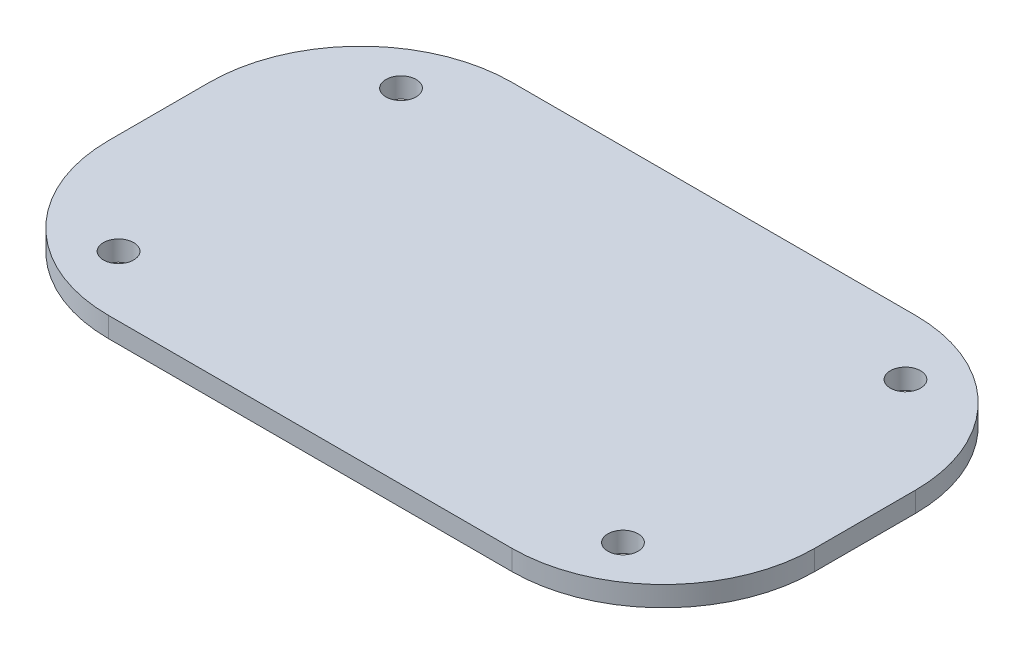
ISO-10303-21;
HEADER;
FILE_DESCRIPTION(('STEP AP214'),'2;1');
FILE_NAME('part.step','',(''),(''),'','','');
FILE_SCHEMA(('AUTOMOTIVE_DESIGN { 1 0 10303 214 1 1 1 1 }'));
ENDSEC;
DATA;
#1=APPLICATION_CONTEXT('core data for automotive mechanical design processes');
#2=APPLICATION_PROTOCOL_DEFINITION('international standard','automotive_design',2000,#1);
#3=PRODUCT_CONTEXT('',#1,'mechanical');
#4=PRODUCT('Part','Part','',(#3));
#5=PRODUCT_RELATED_PRODUCT_CATEGORY('part','',(#4));
#6=PRODUCT_DEFINITION_FORMATION('','',#4);
#7=PRODUCT_DEFINITION_CONTEXT('part definition',#1,'design');
#8=PRODUCT_DEFINITION('design','',#6,#7);
#9=PRODUCT_DEFINITION_SHAPE('','',#8);
#10=(LENGTH_UNIT() NAMED_UNIT(*) SI_UNIT(.MILLI.,.METRE.));
#11=(NAMED_UNIT(*) PLANE_ANGLE_UNIT() SI_UNIT($,.RADIAN.));
#12=(NAMED_UNIT(*) SI_UNIT($,.STERADIAN.) SOLID_ANGLE_UNIT());
#13=UNCERTAINTY_MEASURE_WITH_UNIT(LENGTH_MEASURE(1.E-05),#10,'distance_accuracy_value','');
#14=(GEOMETRIC_REPRESENTATION_CONTEXT(3) GLOBAL_UNCERTAINTY_ASSIGNED_CONTEXT((#13)) GLOBAL_UNIT_ASSIGNED_CONTEXT((#10,
#11,#12)) REPRESENTATION_CONTEXT('',''));
#15=CARTESIAN_POINT('',(0.,0.,0.));
#16=DIRECTION('',(0.,0.,1.));
#17=DIRECTION('',(1.,0.,0.));
#18=AXIS2_PLACEMENT_3D('',#15,#16,#17);
#19=CARTESIAN_POINT('',(35.,2.,20.));
#20=DIRECTION('',(-1.,0.,0.));
#21=DIRECTION('',(0.,0.,1.));
#22=AXIS2_PLACEMENT_3D('',#19,#20,#21);
#23=PLANE('',#22);
#24=DIRECTION('',(0.,0.,-1.));
#25=VECTOR('',#24,1.);
#26=CARTESIAN_POINT('',(35.,2.,20.));
#27=LINE('',#26,#25);
#28=CARTESIAN_POINT('',(35.,2.,5.));
#29=VERTEX_POINT('',#28);
#30=CARTESIAN_POINT('',(35.,2.,-5.));
#31=VERTEX_POINT('',#30);
#32=EDGE_CURVE('E126',#29,#31,#27,.T.);
#33=ORIENTED_EDGE('',*,*,#32,.F.);
#34=DIRECTION('',(0.,-1.,0.));
#35=VECTOR('',#34,1.);
#36=CARTESIAN_POINT('',(35.,2.,5.));
#37=LINE('',#36,#35);
#38=CARTESIAN_POINT('',(35.,0.,5.));
#39=VERTEX_POINT('',#38);
#40=EDGE_CURVE('E152',#29,#39,#37,.T.);
#41=ORIENTED_EDGE('',*,*,#40,.T.);
#42=DIRECTION('',(0.,0.,-1.));
#43=VECTOR('',#42,1.);
#44=CARTESIAN_POINT('',(35.,0.,20.));
#45=LINE('',#44,#43);
#46=CARTESIAN_POINT('',(35.,0.,-5.));
#47=VERTEX_POINT('',#46);
#48=EDGE_CURVE('E158',#39,#47,#45,.T.);
#49=ORIENTED_EDGE('',*,*,#48,.T.);
#50=DIRECTION('',(0.,-1.,0.));
#51=VECTOR('',#50,1.);
#52=CARTESIAN_POINT('',(35.,2.,-5.));
#53=LINE('',#52,#51);
#54=EDGE_CURVE('E150',#47,#31,#53,.F.);
#55=ORIENTED_EDGE('',*,*,#54,.T.);
#56=EDGE_LOOP('',(#33,#41,#49,#55));
#57=FACE_BOUND('',#56,.T.);
#58=ADVANCED_FACE('F34',(#57),#23,.F.);
#59=CARTESIAN_POINT('',(-35.,2.,-20.));
#60=DIRECTION('',(0.,0.,1.));
#61=DIRECTION('',(1.,0.,0.));
#62=AXIS2_PLACEMENT_3D('',#59,#60,#61);
#63=PLANE('',#62);
#64=DIRECTION('',(-1.,0.,0.));
#65=VECTOR('',#64,1.);
#66=CARTESIAN_POINT('',(-35.,2.,-20.));
#67=LINE('',#66,#65);
#68=CARTESIAN_POINT('',(20.,2.,-20.));
#69=VERTEX_POINT('',#68);
#70=CARTESIAN_POINT('',(-20.,2.,-20.));
#71=VERTEX_POINT('',#70);
#72=EDGE_CURVE('E129',#69,#71,#67,.T.);
#73=ORIENTED_EDGE('',*,*,#72,.F.);
#74=DIRECTION('',(0.,-1.,0.));
#75=VECTOR('',#74,1.);
#76=CARTESIAN_POINT('',(20.,2.,-20.));
#77=LINE('',#76,#75);
#78=CARTESIAN_POINT('',(20.,0.,-20.));
#79=VERTEX_POINT('',#78);
#80=EDGE_CURVE('E11',#69,#79,#77,.T.);
#81=ORIENTED_EDGE('',*,*,#80,.T.);
#82=DIRECTION('',(-1.,0.,0.));
#83=VECTOR('',#82,1.);
#84=CARTESIAN_POINT('',(-35.,0.,-20.));
#85=LINE('',#84,#83);
#86=CARTESIAN_POINT('',(-20.,0.,-20.));
#87=VERTEX_POINT('',#86);
#88=EDGE_CURVE('E131',#79,#87,#85,.T.);
#89=ORIENTED_EDGE('',*,*,#88,.T.);
#90=DIRECTION('',(0.,-1.,0.));
#91=VECTOR('',#90,1.);
#92=CARTESIAN_POINT('',(-20.,2.,-20.));
#93=LINE('',#92,#91);
#94=EDGE_CURVE('E42',#87,#71,#93,.F.);
#95=ORIENTED_EDGE('',*,*,#94,.T.);
#96=EDGE_LOOP('',(#73,#81,#89,#95));
#97=FACE_BOUND('',#96,.T.);
#98=ADVANCED_FACE('F219',(#97),#63,.F.);
#99=CARTESIAN_POINT('',(-35.,2.,20.));
#100=DIRECTION('',(1.,0.,0.));
#101=DIRECTION('',(0.,0.,-1.));
#102=AXIS2_PLACEMENT_3D('',#99,#100,#101);
#103=PLANE('',#102);
#104=DIRECTION('',(0.,0.,1.));
#105=VECTOR('',#104,1.);
#106=CARTESIAN_POINT('',(-35.,0.,20.));
#107=LINE('',#106,#105);
#108=CARTESIAN_POINT('',(-35.,0.,-5.));
#109=VERTEX_POINT('',#108);
#110=CARTESIAN_POINT('',(-35.,0.,5.));
#111=VERTEX_POINT('',#110);
#112=EDGE_CURVE('E127',#109,#111,#107,.T.);
#113=ORIENTED_EDGE('',*,*,#112,.T.);
#114=DIRECTION('',(0.,-1.,0.));
#115=VECTOR('',#114,1.);
#116=CARTESIAN_POINT('',(-35.,2.,5.));
#117=LINE('',#116,#115);
#118=CARTESIAN_POINT('',(-35.,2.,5.));
#119=VERTEX_POINT('',#118);
#120=EDGE_CURVE('E105',#111,#119,#117,.F.);
#121=ORIENTED_EDGE('',*,*,#120,.T.);
#122=DIRECTION('',(0.,0.,1.));
#123=VECTOR('',#122,1.);
#124=CARTESIAN_POINT('',(-35.,2.,20.));
#125=LINE('',#124,#123);
#126=CARTESIAN_POINT('',(-35.,2.,-5.));
#127=VERTEX_POINT('',#126);
#128=EDGE_CURVE('E170',#127,#119,#125,.T.);
#129=ORIENTED_EDGE('',*,*,#128,.F.);
#130=DIRECTION('',(0.,-1.,0.));
#131=VECTOR('',#130,1.);
#132=CARTESIAN_POINT('',(-35.,2.,-5.));
#133=LINE('',#132,#131);
#134=EDGE_CURVE('E110',#127,#109,#133,.T.);
#135=ORIENTED_EDGE('',*,*,#134,.T.);
#136=EDGE_LOOP('',(#113,#121,#129,#135));
#137=FACE_BOUND('',#136,.T.);
#138=ADVANCED_FACE('F217',(#137),#103,.F.);
#139=CARTESIAN_POINT('',(-35.,2.,20.));
#140=DIRECTION('',(0.,0.,-1.));
#141=DIRECTION('',(-1.,0.,0.));
#142=AXIS2_PLACEMENT_3D('',#139,#140,#141);
#143=PLANE('',#142);
#144=DIRECTION('',(1.,0.,0.));
#145=VECTOR('',#144,1.);
#146=CARTESIAN_POINT('',(-35.,2.,20.));
#147=LINE('',#146,#145);
#148=CARTESIAN_POINT('',(-20.,2.,20.));
#149=VERTEX_POINT('',#148);
#150=CARTESIAN_POINT('',(20.,2.,20.));
#151=VERTEX_POINT('',#150);
#152=EDGE_CURVE('E120',#149,#151,#147,.T.);
#153=ORIENTED_EDGE('',*,*,#152,.F.);
#154=DIRECTION('',(0.,-1.,0.));
#155=VECTOR('',#154,1.);
#156=CARTESIAN_POINT('',(-20.,2.,20.));
#157=LINE('',#156,#155);
#158=CARTESIAN_POINT('',(-20.,0.,20.));
#159=VERTEX_POINT('',#158);
#160=EDGE_CURVE('E104',#149,#159,#157,.T.);
#161=ORIENTED_EDGE('',*,*,#160,.T.);
#162=DIRECTION('',(1.,0.,0.));
#163=VECTOR('',#162,1.);
#164=CARTESIAN_POINT('',(-35.,0.,20.));
#165=LINE('',#164,#163);
#166=CARTESIAN_POINT('',(20.,0.,20.));
#167=VERTEX_POINT('',#166);
#168=EDGE_CURVE('E117',#159,#167,#165,.T.);
#169=ORIENTED_EDGE('',*,*,#168,.T.);
#170=DIRECTION('',(0.,-1.,0.));
#171=VECTOR('',#170,1.);
#172=CARTESIAN_POINT('',(20.,2.,20.));
#173=LINE('',#172,#171);
#174=EDGE_CURVE('E122',#167,#151,#173,.F.);
#175=ORIENTED_EDGE('',*,*,#174,.T.);
#176=EDGE_LOOP('',(#153,#161,#169,#175));
#177=FACE_BOUND('',#176,.T.);
#178=ADVANCED_FACE('F116',(#177),#143,.F.);
#179=CARTESIAN_POINT('',(0.,2.,0.));
#180=DIRECTION('',(0.,-1.,0.));
#181=DIRECTION('',(0.,0.,-1.));
#182=AXIS2_PLACEMENT_3D('',#179,#180,#181);
#183=PLANE('',#182);
#184=CARTESIAN_POINT('',(25.,2.,-14.));
#185=DIRECTION('',(0.,1.,0.));
#186=DIRECTION('',(0.,0.,1.));
#187=AXIS2_PLACEMENT_3D('',#184,#185,#186);
#188=CIRCLE('',#187,1.5);
#189=CARTESIAN_POINT('',(25.,2.,-12.5));
#190=VERTEX_POINT('',#189);
#191=EDGE_CURVE('E189',#190,#190,#188,.T.);
#192=ORIENTED_EDGE('',*,*,#191,.F.);
#193=EDGE_LOOP('',(#192));
#194=FACE_BOUND('',#193,.T.);
#195=CARTESIAN_POINT('',(25.,2.,14.));
#196=DIRECTION('',(0.,1.,0.));
#197=DIRECTION('',(0.,0.,1.));
#198=AXIS2_PLACEMENT_3D('',#195,#196,#197);
#199=CIRCLE('',#198,1.5);
#200=CARTESIAN_POINT('',(25.,2.,15.5));
#201=VERTEX_POINT('',#200);
#202=EDGE_CURVE('E183',#201,#201,#199,.T.);
#203=ORIENTED_EDGE('',*,*,#202,.F.);
#204=EDGE_LOOP('',(#203));
#205=FACE_BOUND('',#204,.T.);
#206=CARTESIAN_POINT('',(-25.,2.,14.));
#207=DIRECTION('',(0.,1.,0.));
#208=DIRECTION('',(0.,0.,1.));
#209=AXIS2_PLACEMENT_3D('',#206,#207,#208);
#210=CIRCLE('',#209,1.5);
#211=CARTESIAN_POINT('',(-25.,2.,15.5));
#212=VERTEX_POINT('',#211);
#213=EDGE_CURVE('E177',#212,#212,#210,.T.);
#214=ORIENTED_EDGE('',*,*,#213,.F.);
#215=EDGE_LOOP('',(#214));
#216=FACE_BOUND('',#215,.T.);
#217=CARTESIAN_POINT('',(-25.,2.,-14.));
#218=DIRECTION('',(0.,1.,0.));
#219=DIRECTION('',(0.,0.,1.));
#220=AXIS2_PLACEMENT_3D('',#217,#218,#219);
#221=CIRCLE('',#220,1.5);
#222=CARTESIAN_POINT('',(-25.,2.,-12.5));
#223=VERTEX_POINT('',#222);
#224=EDGE_CURVE('E166',#223,#223,#221,.T.);
#225=ORIENTED_EDGE('',*,*,#224,.F.);
#226=EDGE_LOOP('',(#225));
#227=FACE_BOUND('',#226,.T.);
#228=ORIENTED_EDGE('',*,*,#128,.T.);
#229=CARTESIAN_POINT('',(-20.,2.,5.));
#230=DIRECTION('',(0.,-1.,0.));
#231=DIRECTION('',(0.,0.,-1.));
#232=AXIS2_PLACEMENT_3D('',#229,#230,#231);
#233=CIRCLE('',#232,15.);
#234=EDGE_CURVE('E148',#119,#149,#233,.F.);
#235=ORIENTED_EDGE('',*,*,#234,.T.);
#236=ORIENTED_EDGE('',*,*,#152,.T.);
#237=CARTESIAN_POINT('',(20.,2.,5.));
#238=DIRECTION('',(0.,-1.,0.));
#239=DIRECTION('',(0.,0.,-1.));
#240=AXIS2_PLACEMENT_3D('',#237,#238,#239);
#241=CIRCLE('',#240,15.);
#242=EDGE_CURVE('E146',#151,#29,#241,.F.);
#243=ORIENTED_EDGE('',*,*,#242,.T.);
#244=ORIENTED_EDGE('',*,*,#32,.T.);
#245=CARTESIAN_POINT('',(20.,2.,-5.));
#246=DIRECTION('',(0.,-1.,0.));
#247=DIRECTION('',(0.,0.,-1.));
#248=AXIS2_PLACEMENT_3D('',#245,#246,#247);
#249=CIRCLE('',#248,15.);
#250=EDGE_CURVE('E55',#31,#69,#249,.F.);
#251=ORIENTED_EDGE('',*,*,#250,.T.);
#252=ORIENTED_EDGE('',*,*,#72,.T.);
#253=CARTESIAN_POINT('',(-20.,2.,-5.));
#254=DIRECTION('',(0.,-1.,0.));
#255=DIRECTION('',(0.,0.,-1.));
#256=AXIS2_PLACEMENT_3D('',#253,#254,#255);
#257=CIRCLE('',#256,15.);
#258=EDGE_CURVE('E143',#71,#127,#257,.F.);
#259=ORIENTED_EDGE('',*,*,#258,.T.);
#260=EDGE_LOOP('',(#228,#235,#236,#243,#244,#251,#252,#259));
#261=FACE_BOUND('',#260,.T.);
#262=ADVANCED_FACE('F204',(#194,#205,#216,#227,#261),#183,.F.);
#263=CARTESIAN_POINT('',(0.,0.,0.));
#264=DIRECTION('',(0.,-1.,0.));
#265=DIRECTION('',(0.,0.,-1.));
#266=AXIS2_PLACEMENT_3D('',#263,#264,#265);
#267=PLANE('',#266);
#268=CARTESIAN_POINT('',(25.,0.,-14.));
#269=DIRECTION('',(0.,1.,0.));
#270=DIRECTION('',(0.,0.,1.));
#271=AXIS2_PLACEMENT_3D('',#268,#269,#270);
#272=CIRCLE('',#271,1.5);
#273=CARTESIAN_POINT('',(25.,0.,-12.5));
#274=VERTEX_POINT('',#273);
#275=EDGE_CURVE('E175',#274,#274,#272,.T.);
#276=ORIENTED_EDGE('',*,*,#275,.T.);
#277=EDGE_LOOP('',(#276));
#278=FACE_BOUND('',#277,.T.);
#279=CARTESIAN_POINT('',(25.,0.,14.));
#280=DIRECTION('',(0.,1.,0.));
#281=DIRECTION('',(0.,0.,1.));
#282=AXIS2_PLACEMENT_3D('',#279,#280,#281);
#283=CIRCLE('',#282,1.5);
#284=CARTESIAN_POINT('',(25.,0.,15.5));
#285=VERTEX_POINT('',#284);
#286=EDGE_CURVE('E186',#285,#285,#283,.T.);
#287=ORIENTED_EDGE('',*,*,#286,.T.);
#288=EDGE_LOOP('',(#287));
#289=FACE_BOUND('',#288,.T.);
#290=CARTESIAN_POINT('',(-25.,0.,14.));
#291=DIRECTION('',(0.,1.,0.));
#292=DIRECTION('',(0.,0.,1.));
#293=AXIS2_PLACEMENT_3D('',#290,#291,#292);
#294=CIRCLE('',#293,1.5);
#295=CARTESIAN_POINT('',(-25.,0.,15.5));
#296=VERTEX_POINT('',#295);
#297=EDGE_CURVE('E180',#296,#296,#294,.T.);
#298=ORIENTED_EDGE('',*,*,#297,.T.);
#299=EDGE_LOOP('',(#298));
#300=FACE_BOUND('',#299,.T.);
#301=CARTESIAN_POINT('',(-25.,0.,-14.));
#302=DIRECTION('',(0.,1.,0.));
#303=DIRECTION('',(0.,0.,1.));
#304=AXIS2_PLACEMENT_3D('',#301,#302,#303);
#305=CIRCLE('',#304,1.5);
#306=CARTESIAN_POINT('',(-25.,0.,-12.5));
#307=VERTEX_POINT('',#306);
#308=EDGE_CURVE('E163',#307,#307,#305,.T.);
#309=ORIENTED_EDGE('',*,*,#308,.T.);
#310=EDGE_LOOP('',(#309));
#311=FACE_BOUND('',#310,.T.);
#312=ORIENTED_EDGE('',*,*,#168,.F.);
#313=CARTESIAN_POINT('',(-20.,0.,5.));
#314=DIRECTION('',(0.,-1.,0.));
#315=DIRECTION('',(0.,0.,-1.));
#316=AXIS2_PLACEMENT_3D('',#313,#314,#315);
#317=CIRCLE('',#316,15.);
#318=EDGE_CURVE('E100',#159,#111,#317,.T.);
#319=ORIENTED_EDGE('',*,*,#318,.T.);
#320=ORIENTED_EDGE('',*,*,#112,.F.);
#321=CARTESIAN_POINT('',(-20.,0.,-5.));
#322=DIRECTION('',(0.,-1.,0.));
#323=DIRECTION('',(0.,0.,-1.));
#324=AXIS2_PLACEMENT_3D('',#321,#322,#323);
#325=CIRCLE('',#324,15.);
#326=EDGE_CURVE('E121',#109,#87,#325,.T.);
#327=ORIENTED_EDGE('',*,*,#326,.T.);
#328=ORIENTED_EDGE('',*,*,#88,.F.);
#329=CARTESIAN_POINT('',(20.,0.,-5.));
#330=DIRECTION('',(0.,-1.,0.));
#331=DIRECTION('',(0.,0.,-1.));
#332=AXIS2_PLACEMENT_3D('',#329,#330,#331);
#333=CIRCLE('',#332,15.);
#334=EDGE_CURVE('E137',#79,#47,#333,.T.);
#335=ORIENTED_EDGE('',*,*,#334,.T.);
#336=ORIENTED_EDGE('',*,*,#48,.F.);
#337=CARTESIAN_POINT('',(20.,0.,5.));
#338=DIRECTION('',(0.,-1.,0.));
#339=DIRECTION('',(0.,0.,-1.));
#340=AXIS2_PLACEMENT_3D('',#337,#338,#339);
#341=CIRCLE('',#340,15.);
#342=EDGE_CURVE('E111',#39,#167,#341,.T.);
#343=ORIENTED_EDGE('',*,*,#342,.T.);
#344=EDGE_LOOP('',(#312,#319,#320,#327,#328,#335,#336,#343));
#345=FACE_BOUND('',#344,.T.);
#346=ADVANCED_FACE('F124',(#278,#289,#300,#311,#345),#267,.T.);
#347=CARTESIAN_POINT('',(-20.,2.,5.));
#348=DIRECTION('',(0.,-1.,0.));
#349=DIRECTION('',(0.,0.,-1.));
#350=AXIS2_PLACEMENT_3D('',#347,#348,#349);
#351=CYLINDRICAL_SURFACE('',#350,15.);
#352=ORIENTED_EDGE('',*,*,#234,.F.);
#353=ORIENTED_EDGE('',*,*,#120,.F.);
#354=ORIENTED_EDGE('',*,*,#318,.F.);
#355=ORIENTED_EDGE('',*,*,#160,.F.);
#356=EDGE_LOOP('',(#352,#353,#354,#355));
#357=FACE_BOUND('',#356,.T.);
#358=ADVANCED_FACE('F103',(#357),#351,.T.);
#359=CARTESIAN_POINT('',(20.,2.,5.));
#360=DIRECTION('',(0.,-1.,0.));
#361=DIRECTION('',(0.,0.,-1.));
#362=AXIS2_PLACEMENT_3D('',#359,#360,#361);
#363=CYLINDRICAL_SURFACE('',#362,15.);
#364=ORIENTED_EDGE('',*,*,#242,.F.);
#365=ORIENTED_EDGE('',*,*,#174,.F.);
#366=ORIENTED_EDGE('',*,*,#342,.F.);
#367=ORIENTED_EDGE('',*,*,#40,.F.);
#368=EDGE_LOOP('',(#364,#365,#366,#367));
#369=FACE_BOUND('',#368,.T.);
#370=ADVANCED_FACE('F223',(#369),#363,.T.);
#371=CARTESIAN_POINT('',(20.,2.,-5.));
#372=DIRECTION('',(0.,-1.,0.));
#373=DIRECTION('',(0.,0.,-1.));
#374=AXIS2_PLACEMENT_3D('',#371,#372,#373);
#375=CYLINDRICAL_SURFACE('',#374,15.);
#376=ORIENTED_EDGE('',*,*,#250,.F.);
#377=ORIENTED_EDGE('',*,*,#54,.F.);
#378=ORIENTED_EDGE('',*,*,#334,.F.);
#379=ORIENTED_EDGE('',*,*,#80,.F.);
#380=EDGE_LOOP('',(#376,#377,#378,#379));
#381=FACE_BOUND('',#380,.T.);
#382=ADVANCED_FACE('F222',(#381),#375,.T.);
#383=CARTESIAN_POINT('',(-20.,2.,-5.));
#384=DIRECTION('',(0.,-1.,0.));
#385=DIRECTION('',(0.,0.,-1.));
#386=AXIS2_PLACEMENT_3D('',#383,#384,#385);
#387=CYLINDRICAL_SURFACE('',#386,15.);
#388=ORIENTED_EDGE('',*,*,#258,.F.);
#389=ORIENTED_EDGE('',*,*,#94,.F.);
#390=ORIENTED_EDGE('',*,*,#326,.F.);
#391=ORIENTED_EDGE('',*,*,#134,.F.);
#392=EDGE_LOOP('',(#388,#389,#390,#391));
#393=FACE_BOUND('',#392,.T.);
#394=ADVANCED_FACE('F36',(#393),#387,.T.);
#395=CARTESIAN_POINT('',(-25.,0.,-14.));
#396=DIRECTION('',(0.,1.,0.));
#397=DIRECTION('',(0.,0.,1.));
#398=AXIS2_PLACEMENT_3D('',#395,#396,#397);
#399=CYLINDRICAL_SURFACE('',#398,1.5);
#400=ORIENTED_EDGE('',*,*,#308,.F.);
#401=EDGE_LOOP('',(#400));
#402=FACE_BOUND('',#401,.T.);
#403=ORIENTED_EDGE('',*,*,#224,.T.);
#404=EDGE_LOOP('',(#403));
#405=FACE_BOUND('',#404,.T.);
#406=ADVANCED_FACE('F244',(#402,#405),#399,.F.);
#407=CARTESIAN_POINT('',(-25.,0.,14.));
#408=DIRECTION('',(0.,1.,0.));
#409=DIRECTION('',(0.,0.,1.));
#410=AXIS2_PLACEMENT_3D('',#407,#408,#409);
#411=CYLINDRICAL_SURFACE('',#410,1.5);
#412=ORIENTED_EDGE('',*,*,#297,.F.);
#413=EDGE_LOOP('',(#412));
#414=FACE_BOUND('',#413,.T.);
#415=ORIENTED_EDGE('',*,*,#213,.T.);
#416=EDGE_LOOP('',(#415));
#417=FACE_BOUND('',#416,.T.);
#418=ADVANCED_FACE('F247',(#414,#417),#411,.F.);
#419=CARTESIAN_POINT('',(25.,0.,14.));
#420=DIRECTION('',(0.,1.,0.));
#421=DIRECTION('',(0.,0.,1.));
#422=AXIS2_PLACEMENT_3D('',#419,#420,#421);
#423=CYLINDRICAL_SURFACE('',#422,1.5);
#424=ORIENTED_EDGE('',*,*,#286,.F.);
#425=EDGE_LOOP('',(#424));
#426=FACE_BOUND('',#425,.T.);
#427=ORIENTED_EDGE('',*,*,#202,.T.);
#428=EDGE_LOOP('',(#427));
#429=FACE_BOUND('',#428,.T.);
#430=ADVANCED_FACE('F200',(#426,#429),#423,.F.);
#431=CARTESIAN_POINT('',(25.,0.,-14.));
#432=DIRECTION('',(0.,1.,0.));
#433=DIRECTION('',(0.,0.,1.));
#434=AXIS2_PLACEMENT_3D('',#431,#432,#433);
#435=CYLINDRICAL_SURFACE('',#434,1.5);
#436=ORIENTED_EDGE('',*,*,#275,.F.);
#437=EDGE_LOOP('',(#436));
#438=FACE_BOUND('',#437,.T.);
#439=ORIENTED_EDGE('',*,*,#191,.T.);
#440=EDGE_LOOP('',(#439));
#441=FACE_BOUND('',#440,.T.);
#442=ADVANCED_FACE('F197',(#438,#441),#435,.F.);
#443=CLOSED_SHELL('',(#58,#98,#138,#178,#262,#346,#358,#370,#382,#394,#406,#418,#430,#442));
#444=MANIFOLD_SOLID_BREP('B2',#443);
#445=ADVANCED_BREP_SHAPE_REPRESENTATION('',(#18,#444),#14);
#446=SHAPE_DEFINITION_REPRESENTATION(#9,#445);
ENDSEC;
END-ISO-10303-21;
